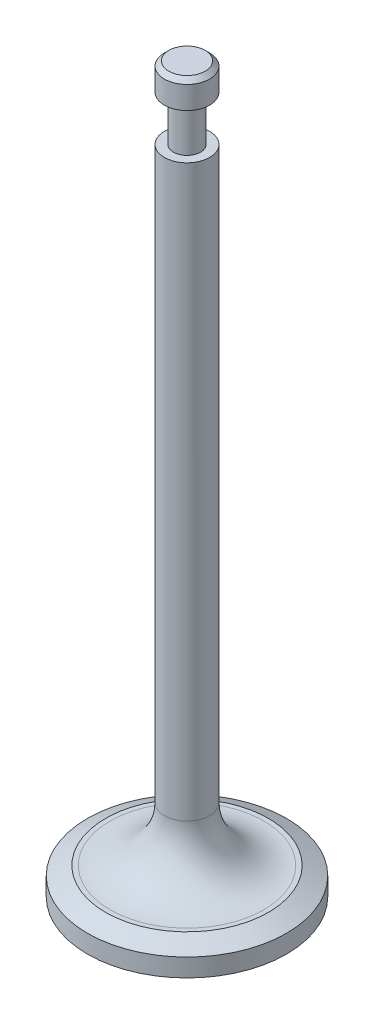
ISO-10303-21;
HEADER;
FILE_DESCRIPTION(('STEP AP214'),'2;1');
FILE_NAME('part.step','',(''),(''),'','','');
FILE_SCHEMA(('AUTOMOTIVE_DESIGN { 1 0 10303 214 1 1 1 1 }'));
ENDSEC;
DATA;
#1=APPLICATION_CONTEXT('core data for automotive mechanical design processes');
#2=APPLICATION_PROTOCOL_DEFINITION('international standard','automotive_design',2000,#1);
#3=PRODUCT_CONTEXT('',#1,'mechanical');
#4=PRODUCT('Part','Part','',(#3));
#5=PRODUCT_RELATED_PRODUCT_CATEGORY('part','',(#4));
#6=PRODUCT_DEFINITION_FORMATION('','',#4);
#7=PRODUCT_DEFINITION_CONTEXT('part definition',#1,'design');
#8=PRODUCT_DEFINITION('design','',#6,#7);
#9=PRODUCT_DEFINITION_SHAPE('','',#8);
#10=(LENGTH_UNIT() NAMED_UNIT(*) SI_UNIT(.MILLI.,.METRE.));
#11=(NAMED_UNIT(*) PLANE_ANGLE_UNIT() SI_UNIT($,.RADIAN.));
#12=(NAMED_UNIT(*) SI_UNIT($,.STERADIAN.) SOLID_ANGLE_UNIT());
#13=UNCERTAINTY_MEASURE_WITH_UNIT(LENGTH_MEASURE(1.E-05),#10,'distance_accuracy_value','');
#14=(GEOMETRIC_REPRESENTATION_CONTEXT(3) GLOBAL_UNCERTAINTY_ASSIGNED_CONTEXT((#13)) GLOBAL_UNIT_ASSIGNED_CONTEXT((#10,
#11,#12)) REPRESENTATION_CONTEXT('',''));
#15=CARTESIAN_POINT('',(0.,0.,0.));
#16=DIRECTION('',(0.,0.,1.));
#17=DIRECTION('',(1.,0.,0.));
#18=AXIS2_PLACEMENT_3D('',#15,#16,#17);
#19=CARTESIAN_POINT('',(11.,0.,0.));
#20=DIRECTION('',(0.,-1.,0.));
#21=DIRECTION('',(0.,0.,-1.));
#22=AXIS2_PLACEMENT_3D('',#19,#20,#21);
#23=PLANE('',#22);
#24=CARTESIAN_POINT('',(0.,0.,0.));
#25=DIRECTION('',(0.,-1.,0.));
#26=DIRECTION('',(0.,0.,-1.));
#27=AXIS2_PLACEMENT_3D('',#24,#25,#26);
#28=CIRCLE('',#27,11.);
#29=CARTESIAN_POINT('',(0.,0.,-11.));
#30=VERTEX_POINT('',#29);
#31=EDGE_CURVE('E88',#30,#30,#28,.T.);
#32=ORIENTED_EDGE('',*,*,#31,.T.);
#33=EDGE_LOOP('',(#32));
#34=FACE_BOUND('',#33,.T.);
#35=ADVANCED_FACE('F39',(#34),#23,.T.);
#36=CARTESIAN_POINT('',(0.,80.,0.));
#37=DIRECTION('',(0.,1.,0.));
#38=DIRECTION('',(0.,0.,1.));
#39=AXIS2_PLACEMENT_3D('',#36,#37,#38);
#40=PLANE('',#39);
#41=CARTESIAN_POINT('',(0.,80.,0.));
#42=DIRECTION('',(0.,1.,0.));
#43=DIRECTION('',(0.,0.,1.));
#44=AXIS2_PLACEMENT_3D('',#41,#42,#43);
#45=CIRCLE('',#44,2.00000000000001);
#46=CARTESIAN_POINT('',(0.,80.,2.00000000000001));
#47=VERTEX_POINT('',#46);
#48=EDGE_CURVE('E53',#47,#47,#45,.T.);
#49=ORIENTED_EDGE('',*,*,#48,.T.);
#50=EDGE_LOOP('',(#49));
#51=FACE_BOUND('',#50,.T.);
#52=ADVANCED_FACE('F109',(#51),#40,.T.);
#53=CARTESIAN_POINT('',(0.,0.,0.));
#54=DIRECTION('',(0.,-1.,0.));
#55=DIRECTION('',(0.,0.,-1.));
#56=AXIS2_PLACEMENT_3D('',#53,#54,#55);
#57=CYLINDRICAL_SURFACE('',#56,2.5);
#58=CARTESIAN_POINT('',(0.,79.5,0.));
#59=DIRECTION('',(0.,1.,0.));
#60=DIRECTION('',(0.,0.,1.));
#61=AXIS2_PLACEMENT_3D('',#58,#59,#60);
#62=CIRCLE('',#61,2.5);
#63=CARTESIAN_POINT('',(0.,79.5,2.5));
#64=VERTEX_POINT('',#63);
#65=EDGE_CURVE('E58',#64,#64,#62,.F.);
#66=ORIENTED_EDGE('',*,*,#65,.T.);
#67=EDGE_LOOP('',(#66));
#68=FACE_BOUND('',#67,.T.);
#69=CARTESIAN_POINT('',(0.,77.,0.));
#70=DIRECTION('',(0.,-1.,0.));
#71=DIRECTION('',(0.,0.,-1.));
#72=AXIS2_PLACEMENT_3D('',#69,#70,#71);
#73=CIRCLE('',#72,2.5);
#74=CARTESIAN_POINT('',(0.,77.,-2.5));
#75=VERTEX_POINT('',#74);
#76=EDGE_CURVE('E72',#75,#75,#73,.T.);
#77=ORIENTED_EDGE('',*,*,#76,.F.);
#78=EDGE_LOOP('',(#77));
#79=FACE_BOUND('',#78,.T.);
#80=ADVANCED_FACE('F114',(#68,#79),#57,.T.);
#81=CARTESIAN_POINT('',(2.5,77.,0.));
#82=DIRECTION('',(0.,-1.,0.));
#83=DIRECTION('',(0.,0.,-1.));
#84=AXIS2_PLACEMENT_3D('',#81,#82,#83);
#85=PLANE('',#84);
#86=ORIENTED_EDGE('',*,*,#76,.T.);
#87=EDGE_LOOP('',(#86));
#88=FACE_BOUND('',#87,.T.);
#89=CARTESIAN_POINT('',(0.,77.,0.));
#90=DIRECTION('',(0.,-1.,0.));
#91=DIRECTION('',(0.,0.,-1.));
#92=AXIS2_PLACEMENT_3D('',#89,#90,#91);
#93=CIRCLE('',#92,1.5);
#94=CARTESIAN_POINT('',(0.,77.,-1.5));
#95=VERTEX_POINT('',#94);
#96=EDGE_CURVE('E76',#95,#95,#93,.T.);
#97=ORIENTED_EDGE('',*,*,#96,.F.);
#98=EDGE_LOOP('',(#97));
#99=FACE_BOUND('',#98,.T.);
#100=ADVANCED_FACE('F133',(#88,#99),#85,.T.);
#101=CARTESIAN_POINT('',(0.,0.,0.));
#102=DIRECTION('',(0.,-1.,0.));
#103=DIRECTION('',(0.,0.,-1.));
#104=AXIS2_PLACEMENT_3D('',#101,#102,#103);
#105=CYLINDRICAL_SURFACE('',#104,1.5);
#106=ORIENTED_EDGE('',*,*,#96,.T.);
#107=EDGE_LOOP('',(#106));
#108=FACE_BOUND('',#107,.T.);
#109=CARTESIAN_POINT('',(0.,72.,0.));
#110=DIRECTION('',(0.,-1.,0.));
#111=DIRECTION('',(0.,0.,-1.));
#112=AXIS2_PLACEMENT_3D('',#109,#110,#111);
#113=CIRCLE('',#112,1.5);
#114=CARTESIAN_POINT('',(0.,72.,-1.5));
#115=VERTEX_POINT('',#114);
#116=EDGE_CURVE('E80',#115,#115,#113,.T.);
#117=ORIENTED_EDGE('',*,*,#116,.F.);
#118=EDGE_LOOP('',(#117));
#119=FACE_BOUND('',#118,.T.);
#120=ADVANCED_FACE('F138',(#108,#119),#105,.T.);
#121=CARTESIAN_POINT('',(1.5,72.,0.));
#122=DIRECTION('',(0.,1.,0.));
#123=DIRECTION('',(0.,0.,1.));
#124=AXIS2_PLACEMENT_3D('',#121,#122,#123);
#125=PLANE('',#124);
#126=ORIENTED_EDGE('',*,*,#116,.T.);
#127=EDGE_LOOP('',(#126));
#128=FACE_BOUND('',#127,.T.);
#129=CARTESIAN_POINT('',(0.,72.,0.));
#130=DIRECTION('',(0.,-1.,0.));
#131=DIRECTION('',(0.,0.,-1.));
#132=AXIS2_PLACEMENT_3D('',#129,#130,#131);
#133=CIRCLE('',#132,2.5);
#134=CARTESIAN_POINT('',(0.,72.,-2.5));
#135=VERTEX_POINT('',#134);
#136=EDGE_CURVE('E84',#135,#135,#133,.T.);
#137=ORIENTED_EDGE('',*,*,#136,.F.);
#138=EDGE_LOOP('',(#137));
#139=FACE_BOUND('',#138,.T.);
#140=ADVANCED_FACE('F144',(#128,#139),#125,.T.);
#141=CARTESIAN_POINT('',(0.,0.,0.));
#142=DIRECTION('',(0.,-1.,0.));
#143=DIRECTION('',(0.,0.,-1.));
#144=AXIS2_PLACEMENT_3D('',#141,#142,#143);
#145=CYLINDRICAL_SURFACE('',#144,2.5);
#146=CARTESIAN_POINT('',(0.,9.,0.));
#147=DIRECTION('',(0.,1.,0.));
#148=DIRECTION('',(0.,0.,1.));
#149=AXIS2_PLACEMENT_3D('',#146,#147,#148);
#150=CIRCLE('',#149,2.5);
#151=CARTESIAN_POINT('',(0.,9.,2.5));
#152=VERTEX_POINT('',#151);
#153=EDGE_CURVE('E64',#152,#152,#150,.T.);
#154=ORIENTED_EDGE('',*,*,#153,.T.);
#155=EDGE_LOOP('',(#154));
#156=FACE_BOUND('',#155,.T.);
#157=ORIENTED_EDGE('',*,*,#136,.T.);
#158=EDGE_LOOP('',(#157));
#159=FACE_BOUND('',#158,.T.);
#160=ADVANCED_FACE('F106',(#156,#159),#145,.T.);
#161=CARTESIAN_POINT('',(2.50000000000001,3.,0.));
#162=DIRECTION('',(0.,1.,0.));
#163=DIRECTION('',(0.,0.,1.));
#164=AXIS2_PLACEMENT_3D('',#161,#162,#163);
#165=PLANE('',#164);
#166=CARTESIAN_POINT('',(0.,3.,0.));
#167=DIRECTION('',(0.,1.,0.));
#168=DIRECTION('',(0.,0.,1.));
#169=AXIS2_PLACEMENT_3D('',#166,#167,#168);
#170=CIRCLE('',#169,8.99999999999998);
#171=CARTESIAN_POINT('',(0.,3.,8.99999999999998));
#172=VERTEX_POINT('',#171);
#173=EDGE_CURVE('E10',#172,#172,#170,.T.);
#174=ORIENTED_EDGE('',*,*,#173,.T.);
#175=EDGE_LOOP('',(#174));
#176=FACE_BOUND('',#175,.T.);
#177=CARTESIAN_POINT('',(0.,3.,0.));
#178=DIRECTION('',(0.,1.,0.));
#179=DIRECTION('',(0.,0.,1.));
#180=AXIS2_PLACEMENT_3D('',#177,#178,#179);
#181=CIRCLE('',#180,8.5);
#182=CARTESIAN_POINT('',(0.,3.,8.5));
#183=VERTEX_POINT('',#182);
#184=EDGE_CURVE('E68',#183,#183,#181,.F.);
#185=ORIENTED_EDGE('',*,*,#184,.T.);
#186=EDGE_LOOP('',(#185));
#187=FACE_BOUND('',#186,.T.);
#188=ADVANCED_FACE('F97',(#176,#187),#165,.T.);
#189=CARTESIAN_POINT('',(0.,0.,0.));
#190=DIRECTION('',(0.,-1.,0.));
#191=DIRECTION('',(0.,0.,-1.));
#192=AXIS2_PLACEMENT_3D('',#189,#190,#191);
#193=CYLINDRICAL_SURFACE('',#192,11.);
#194=CARTESIAN_POINT('',(0.,1.99999999999999,0.));
#195=DIRECTION('',(0.,1.,0.));
#196=DIRECTION('',(0.,0.,1.));
#197=AXIS2_PLACEMENT_3D('',#194,#195,#196);
#198=CIRCLE('',#197,11.);
#199=CARTESIAN_POINT('',(0.,1.99999999999999,11.));
#200=VERTEX_POINT('',#199);
#201=EDGE_CURVE('E48',#200,#200,#198,.F.);
#202=ORIENTED_EDGE('',*,*,#201,.T.);
#203=EDGE_LOOP('',(#202));
#204=FACE_BOUND('',#203,.T.);
#205=ORIENTED_EDGE('',*,*,#31,.F.);
#206=EDGE_LOOP('',(#205));
#207=FACE_BOUND('',#206,.T.);
#208=ADVANCED_FACE('F94',(#204,#207),#193,.T.);
#209=CARTESIAN_POINT('',(0.,9.,0.));
#210=DIRECTION('',(0.,1.,0.));
#211=DIRECTION('',(0.,0.,1.));
#212=AXIS2_PLACEMENT_3D('',#209,#210,#211);
#213=TOROIDAL_SURFACE('',#212,8.5,6.);
#214=ORIENTED_EDGE('',*,*,#153,.F.);
#215=EDGE_LOOP('',(#214));
#216=FACE_BOUND('',#215,.T.);
#217=ORIENTED_EDGE('',*,*,#184,.F.);
#218=EDGE_LOOP('',(#217));
#219=FACE_BOUND('',#218,.T.);
#220=ADVANCED_FACE('F96',(#216,#219),#213,.F.);
#221=CARTESIAN_POINT('',(0.,79.5,0.));
#222=DIRECTION('',(0.,-1.,0.));
#223=DIRECTION('',(0.,0.,-1.));
#224=AXIS2_PLACEMENT_3D('',#221,#222,#223);
#225=CONICAL_SURFACE('',#224,2.5,0.785398163397453);
#226=ORIENTED_EDGE('',*,*,#48,.F.);
#227=EDGE_LOOP('',(#226));
#228=FACE_BOUND('',#227,.T.);
#229=ORIENTED_EDGE('',*,*,#65,.F.);
#230=EDGE_LOOP('',(#229));
#231=FACE_BOUND('',#230,.T.);
#232=ADVANCED_FACE('F103',(#228,#231),#225,.T.);
#233=CARTESIAN_POINT('',(0.,1.99999999999999,0.));
#234=DIRECTION('',(0.,-1.,0.));
#235=DIRECTION('',(0.,0.,-1.));
#236=AXIS2_PLACEMENT_3D('',#233,#234,#235);
#237=CONICAL_SURFACE('',#236,11.,1.10714871779409);
#238=ORIENTED_EDGE('',*,*,#173,.F.);
#239=EDGE_LOOP('',(#238));
#240=FACE_BOUND('',#239,.T.);
#241=ORIENTED_EDGE('',*,*,#201,.F.);
#242=EDGE_LOOP('',(#241));
#243=FACE_BOUND('',#242,.T.);
#244=ADVANCED_FACE('F42',(#240,#243),#237,.T.);
#245=CLOSED_SHELL('',(#35,#52,#80,#100,#120,#140,#160,#188,#208,#220,#232,#244));
#246=MANIFOLD_SOLID_BREP('B2',#245);
#247=ADVANCED_BREP_SHAPE_REPRESENTATION('',(#18,#246),#14);
#248=SHAPE_DEFINITION_REPRESENTATION(#9,#247);
ENDSEC;
END-ISO-10303-21;
